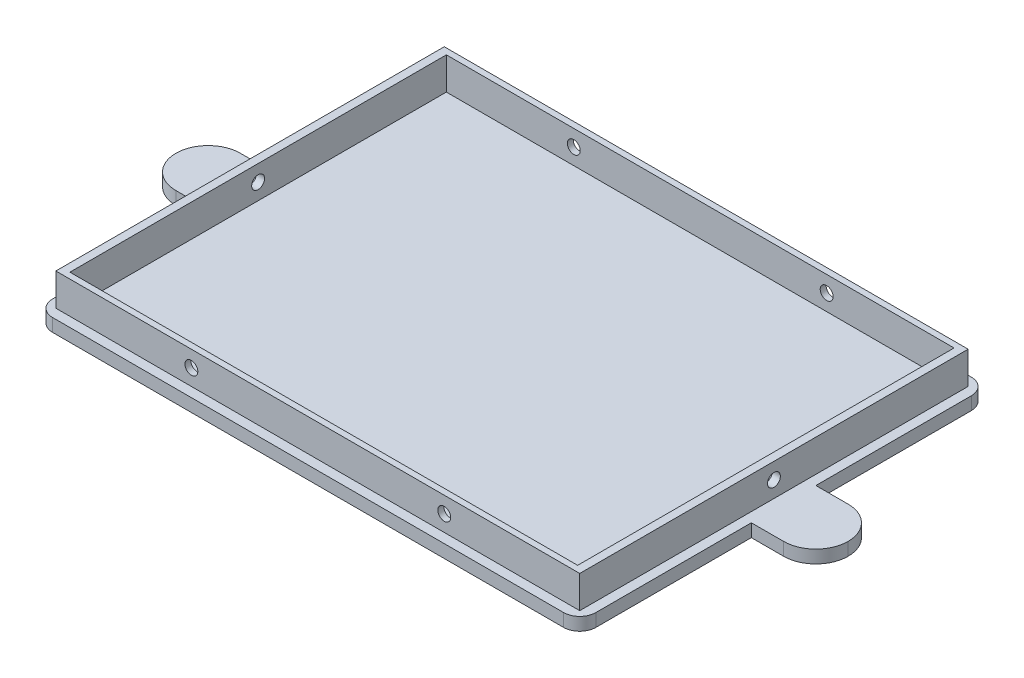
ISO-10303-21;
HEADER;
FILE_DESCRIPTION(('STEP AP214'),'2;1');
FILE_NAME('part.step','',(''),(''),'','','');
FILE_SCHEMA(('AUTOMOTIVE_DESIGN { 1 0 10303 214 1 1 1 1 }'));
ENDSEC;
DATA;
#1=APPLICATION_CONTEXT('core data for automotive mechanical design processes');
#2=APPLICATION_PROTOCOL_DEFINITION('international standard','automotive_design',2000,#1);
#3=PRODUCT_CONTEXT('',#1,'mechanical');
#4=PRODUCT('Part','Part','',(#3));
#5=PRODUCT_RELATED_PRODUCT_CATEGORY('part','',(#4));
#6=PRODUCT_DEFINITION_FORMATION('','',#4);
#7=PRODUCT_DEFINITION_CONTEXT('part definition',#1,'design');
#8=PRODUCT_DEFINITION('design','',#6,#7);
#9=PRODUCT_DEFINITION_SHAPE('','',#8);
#10=(LENGTH_UNIT() NAMED_UNIT(*) SI_UNIT(.MILLI.,.METRE.));
#11=(NAMED_UNIT(*) PLANE_ANGLE_UNIT() SI_UNIT($,.RADIAN.));
#12=(NAMED_UNIT(*) SI_UNIT($,.STERADIAN.) SOLID_ANGLE_UNIT());
#13=UNCERTAINTY_MEASURE_WITH_UNIT(LENGTH_MEASURE(1.E-05),#10,'distance_accuracy_value','');
#14=(GEOMETRIC_REPRESENTATION_CONTEXT(3) GLOBAL_UNCERTAINTY_ASSIGNED_CONTEXT((#13)) GLOBAL_UNIT_ASSIGNED_CONTEXT((#10,
#11,#12)) REPRESENTATION_CONTEXT('',''));
#15=CARTESIAN_POINT('',(0.,0.,0.));
#16=DIRECTION('',(0.,0.,1.));
#17=DIRECTION('',(1.,0.,0.));
#18=AXIS2_PLACEMENT_3D('',#15,#16,#17);
#19=CARTESIAN_POINT('',(0.,4.,0.));
#20=DIRECTION('',(0.,1.,0.));
#21=DIRECTION('',(0.,0.,1.));
#22=AXIS2_PLACEMENT_3D('',#19,#20,#21);
#23=PLANE('',#22);
#24=DIRECTION('',(-1.,0.,0.));
#25=VECTOR('',#24,1.);
#26=CARTESIAN_POINT('',(-84.19,4.,-63.195));
#27=LINE('',#26,#25);
#28=CARTESIAN_POINT('',(79.19,4.,-63.195));
#29=VERTEX_POINT('',#28);
#30=CARTESIAN_POINT('',(-79.19,4.,-63.195));
#31=VERTEX_POINT('',#30);
#32=EDGE_CURVE('E293',#29,#31,#27,.T.);
#33=ORIENTED_EDGE('',*,*,#32,.T.);
#34=CARTESIAN_POINT('',(-79.19,4.,-58.195));
#35=DIRECTION('',(0.,1.,0.));
#36=DIRECTION('',(0.,0.,1.));
#37=AXIS2_PLACEMENT_3D('',#34,#35,#36);
#38=CIRCLE('',#37,5.);
#39=CARTESIAN_POINT('',(-84.19,4.,-58.195));
#40=VERTEX_POINT('',#39);
#41=EDGE_CURVE('E396',#31,#40,#38,.T.);
#42=ORIENTED_EDGE('',*,*,#41,.T.);
#43=DIRECTION('',(0.,0.,1.));
#44=VECTOR('',#43,1.);
#45=CARTESIAN_POINT('',(-84.19,4.,-63.195));
#46=LINE('',#45,#44);
#47=CARTESIAN_POINT('',(-84.19,4.,-10.));
#48=VERTEX_POINT('',#47);
#49=EDGE_CURVE('E296',#40,#48,#46,.T.);
#50=ORIENTED_EDGE('',*,*,#49,.T.);
#51=DIRECTION('',(-1.,0.,0.));
#52=VECTOR('',#51,1.);
#53=CARTESIAN_POINT('',(-84.19,4.,-10.));
#54=LINE('',#53,#52);
#55=CARTESIAN_POINT('',(-94.19,4.,-10.));
#56=VERTEX_POINT('',#55);
#57=EDGE_CURVE('E298',#48,#56,#54,.T.);
#58=ORIENTED_EDGE('',*,*,#57,.T.);
#59=CARTESIAN_POINT('',(-94.19,4.,0.));
#60=DIRECTION('',(0.,1.,0.));
#61=DIRECTION('',(0.,0.,1.));
#62=AXIS2_PLACEMENT_3D('',#59,#60,#61);
#63=CIRCLE('',#62,10.);
#64=CARTESIAN_POINT('',(-104.19,4.,0.));
#65=VERTEX_POINT('',#64);
#66=EDGE_CURVE('E356',#56,#65,#63,.T.);
#67=ORIENTED_EDGE('',*,*,#66,.T.);
#68=CARTESIAN_POINT('',(-94.19,4.,0.));
#69=DIRECTION('',(0.,1.,0.));
#70=DIRECTION('',(0.,0.,1.));
#71=AXIS2_PLACEMENT_3D('',#68,#69,#70);
#72=CIRCLE('',#71,10.);
#73=CARTESIAN_POINT('',(-94.19,4.,10.));
#74=VERTEX_POINT('',#73);
#75=EDGE_CURVE('E354',#65,#74,#72,.T.);
#76=ORIENTED_EDGE('',*,*,#75,.T.);
#77=DIRECTION('',(1.,0.,0.));
#78=VECTOR('',#77,1.);
#79=CARTESIAN_POINT('',(-104.19,4.,10.));
#80=LINE('',#79,#78);
#81=CARTESIAN_POINT('',(-84.19,4.,10.));
#82=VERTEX_POINT('',#81);
#83=EDGE_CURVE('E301',#74,#82,#80,.T.);
#84=ORIENTED_EDGE('',*,*,#83,.T.);
#85=DIRECTION('',(0.,0.,1.));
#86=VECTOR('',#85,1.);
#87=CARTESIAN_POINT('',(-84.19,4.,10.));
#88=LINE('',#87,#86);
#89=CARTESIAN_POINT('',(-84.19,4.,58.195));
#90=VERTEX_POINT('',#89);
#91=EDGE_CURVE('E303',#82,#90,#88,.T.);
#92=ORIENTED_EDGE('',*,*,#91,.T.);
#93=CARTESIAN_POINT('',(-79.19,4.,58.195));
#94=DIRECTION('',(0.,1.,0.));
#95=DIRECTION('',(0.,0.,1.));
#96=AXIS2_PLACEMENT_3D('',#93,#94,#95);
#97=CIRCLE('',#96,5.);
#98=CARTESIAN_POINT('',(-79.19,4.,63.195));
#99=VERTEX_POINT('',#98);
#100=EDGE_CURVE('E391',#90,#99,#97,.T.);
#101=ORIENTED_EDGE('',*,*,#100,.T.);
#102=DIRECTION('',(1.,0.,0.));
#103=VECTOR('',#102,1.);
#104=CARTESIAN_POINT('',(-84.19,4.,63.195));
#105=LINE('',#104,#103);
#106=CARTESIAN_POINT('',(79.19,4.,63.195));
#107=VERTEX_POINT('',#106);
#108=EDGE_CURVE('E306',#99,#107,#105,.T.);
#109=ORIENTED_EDGE('',*,*,#108,.T.);
#110=CARTESIAN_POINT('',(79.19,4.,58.195));
#111=DIRECTION('',(0.,1.,0.));
#112=DIRECTION('',(0.,0.,1.));
#113=AXIS2_PLACEMENT_3D('',#110,#111,#112);
#114=CIRCLE('',#113,5.);
#115=CARTESIAN_POINT('',(84.19,4.,58.195));
#116=VERTEX_POINT('',#115);
#117=EDGE_CURVE('E50',#107,#116,#114,.T.);
#118=ORIENTED_EDGE('',*,*,#117,.T.);
#119=DIRECTION('',(0.,0.,-1.));
#120=VECTOR('',#119,1.);
#121=CARTESIAN_POINT('',(84.1899999999999,4.,10.));
#122=LINE('',#121,#120);
#123=CARTESIAN_POINT('',(84.1899999999999,4.,10.));
#124=VERTEX_POINT('',#123);
#125=EDGE_CURVE('E282',#116,#124,#122,.T.);
#126=ORIENTED_EDGE('',*,*,#125,.T.);
#127=DIRECTION('',(1.,0.,0.));
#128=VECTOR('',#127,1.);
#129=CARTESIAN_POINT('',(104.19,4.,10.));
#130=LINE('',#129,#128);
#131=CARTESIAN_POINT('',(94.19,4.,10.));
#132=VERTEX_POINT('',#131);
#133=EDGE_CURVE('E284',#124,#132,#130,.T.);
#134=ORIENTED_EDGE('',*,*,#133,.T.);
#135=CARTESIAN_POINT('',(94.19,4.,0.));
#136=DIRECTION('',(0.,1.,0.));
#137=DIRECTION('',(0.,0.,1.));
#138=AXIS2_PLACEMENT_3D('',#135,#136,#137);
#139=CIRCLE('',#138,10.);
#140=CARTESIAN_POINT('',(104.19,4.,0.));
#141=VERTEX_POINT('',#140);
#142=EDGE_CURVE('E358',#132,#141,#139,.T.);
#143=ORIENTED_EDGE('',*,*,#142,.T.);
#144=CARTESIAN_POINT('',(94.19,4.,0.));
#145=DIRECTION('',(0.,1.,0.));
#146=DIRECTION('',(0.,0.,1.));
#147=AXIS2_PLACEMENT_3D('',#144,#145,#146);
#148=CIRCLE('',#147,10.);
#149=CARTESIAN_POINT('',(94.19,4.,-10.));
#150=VERTEX_POINT('',#149);
#151=EDGE_CURVE('E360',#141,#150,#148,.T.);
#152=ORIENTED_EDGE('',*,*,#151,.T.);
#153=DIRECTION('',(-1.,0.,0.));
#154=VECTOR('',#153,1.);
#155=CARTESIAN_POINT('',(84.1899999999999,4.,-10.));
#156=LINE('',#155,#154);
#157=CARTESIAN_POINT('',(84.1899999999999,4.,-10.));
#158=VERTEX_POINT('',#157);
#159=EDGE_CURVE('E288',#150,#158,#156,.T.);
#160=ORIENTED_EDGE('',*,*,#159,.T.);
#161=DIRECTION('',(0.,0.,-1.));
#162=VECTOR('',#161,1.);
#163=CARTESIAN_POINT('',(84.19,4.,-63.195));
#164=LINE('',#163,#162);
#165=CARTESIAN_POINT('',(84.19,4.,-58.195));
#166=VERTEX_POINT('',#165);
#167=EDGE_CURVE('E290',#158,#166,#164,.T.);
#168=ORIENTED_EDGE('',*,*,#167,.T.);
#169=CARTESIAN_POINT('',(79.19,4.,-58.195));
#170=DIRECTION('',(0.,1.,0.));
#171=DIRECTION('',(0.,0.,1.));
#172=AXIS2_PLACEMENT_3D('',#169,#170,#171);
#173=CIRCLE('',#172,5.);
#174=EDGE_CURVE('E394',#166,#29,#173,.T.);
#175=ORIENTED_EDGE('',*,*,#174,.T.);
#176=EDGE_LOOP('',(#33,#42,#50,#58,#67,#76,#84,#92,#101,#109,#118,#126,#134,#143,#152,#160,#168,#175));
#177=FACE_BOUND('',#176,.T.);
#178=DIRECTION('',(-1.,0.,0.));
#179=VECTOR('',#178,1.);
#180=CARTESIAN_POINT('',(-81.19,4.,-60.195));
#181=LINE('',#180,#179);
#182=CARTESIAN_POINT('',(81.19,4.,-60.195));
#183=VERTEX_POINT('',#182);
#184=CARTESIAN_POINT('',(-81.19,4.,-60.195));
#185=VERTEX_POINT('',#184);
#186=EDGE_CURVE('E266',#183,#185,#181,.T.);
#187=ORIENTED_EDGE('',*,*,#186,.F.);
#188=DIRECTION('',(0.,0.,-1.));
#189=VECTOR('',#188,1.);
#190=CARTESIAN_POINT('',(81.19,4.,-60.195));
#191=LINE('',#190,#189);
#192=CARTESIAN_POINT('',(81.19,4.,60.195));
#193=VERTEX_POINT('',#192);
#194=EDGE_CURVE('E228',#193,#183,#191,.T.);
#195=ORIENTED_EDGE('',*,*,#194,.F.);
#196=DIRECTION('',(1.,0.,0.));
#197=VECTOR('',#196,1.);
#198=CARTESIAN_POINT('',(-81.19,4.,60.195));
#199=LINE('',#198,#197);
#200=CARTESIAN_POINT('',(-81.19,4.,60.195));
#201=VERTEX_POINT('',#200);
#202=EDGE_CURVE('E257',#201,#193,#199,.T.);
#203=ORIENTED_EDGE('',*,*,#202,.F.);
#204=DIRECTION('',(0.,0.,1.));
#205=VECTOR('',#204,1.);
#206=CARTESIAN_POINT('',(-81.19,4.,-60.195));
#207=LINE('',#206,#205);
#208=EDGE_CURVE('E268',#185,#201,#207,.T.);
#209=ORIENTED_EDGE('',*,*,#208,.F.);
#210=EDGE_LOOP('',(#187,#195,#203,#209));
#211=FACE_BOUND('',#210,.T.);
#212=ADVANCED_FACE('F33',(#177,#211),#23,.T.);
#213=CARTESIAN_POINT('',(84.1899999999999,4.,10.));
#214=DIRECTION('',(-1.,0.,0.));
#215=DIRECTION('',(0.,0.,1.));
#216=AXIS2_PLACEMENT_3D('',#213,#214,#215);
#217=PLANE('',#216);
#218=ORIENTED_EDGE('',*,*,#125,.F.);
#219=DIRECTION('',(0.,-1.,0.));
#220=VECTOR('',#219,1.);
#221=CARTESIAN_POINT('',(84.19,4.,58.195));
#222=LINE('',#221,#220);
#223=CARTESIAN_POINT('',(84.19,0.,58.195));
#224=VERTEX_POINT('',#223);
#225=EDGE_CURVE('E400',#116,#224,#222,.T.);
#226=ORIENTED_EDGE('',*,*,#225,.T.);
#227=DIRECTION('',(0.,0.,-1.));
#228=VECTOR('',#227,1.);
#229=CARTESIAN_POINT('',(84.1899999999999,0.,10.));
#230=LINE('',#229,#228);
#231=CARTESIAN_POINT('',(84.1899999999999,0.,10.));
#232=VERTEX_POINT('',#231);
#233=EDGE_CURVE('E281',#224,#232,#230,.T.);
#234=ORIENTED_EDGE('',*,*,#233,.T.);
#235=DIRECTION('',(0.,-1.,0.));
#236=VECTOR('',#235,1.);
#237=CARTESIAN_POINT('',(84.1899999999999,4.,10.));
#238=LINE('',#237,#236);
#239=EDGE_CURVE('E340',#124,#232,#238,.T.);
#240=ORIENTED_EDGE('',*,*,#239,.F.);
#241=EDGE_LOOP('',(#218,#226,#234,#240));
#242=FACE_BOUND('',#241,.T.);
#243=ADVANCED_FACE('F461',(#242),#217,.F.);
#244=CARTESIAN_POINT('',(104.19,4.,10.));
#245=DIRECTION('',(0.,0.,-1.));
#246=DIRECTION('',(-1.,0.,0.));
#247=AXIS2_PLACEMENT_3D('',#244,#245,#246);
#248=PLANE('',#247);
#249=DIRECTION('',(1.,0.,0.));
#250=VECTOR('',#249,1.);
#251=CARTESIAN_POINT('',(104.19,0.,10.));
#252=LINE('',#251,#250);
#253=CARTESIAN_POINT('',(94.19,0.,10.));
#254=VERTEX_POINT('',#253);
#255=EDGE_CURVE('E310',#232,#254,#252,.T.);
#256=ORIENTED_EDGE('',*,*,#255,.T.);
#257=DIRECTION('',(0.,-1.,0.));
#258=VECTOR('',#257,1.);
#259=CARTESIAN_POINT('',(94.19,4.,10.));
#260=LINE('',#259,#258);
#261=EDGE_CURVE('E362',#254,#132,#260,.F.);
#262=ORIENTED_EDGE('',*,*,#261,.T.);
#263=ORIENTED_EDGE('',*,*,#133,.F.);
#264=ORIENTED_EDGE('',*,*,#239,.T.);
#265=EDGE_LOOP('',(#256,#262,#263,#264));
#266=FACE_BOUND('',#265,.T.);
#267=ADVANCED_FACE('F467',(#266),#248,.F.);
#268=CARTESIAN_POINT('',(84.1899999999999,4.,-10.));
#269=DIRECTION('',(0.,0.,1.));
#270=DIRECTION('',(1.,0.,0.));
#271=AXIS2_PLACEMENT_3D('',#268,#269,#270);
#272=PLANE('',#271);
#273=ORIENTED_EDGE('',*,*,#159,.F.);
#274=DIRECTION('',(0.,-1.,0.));
#275=VECTOR('',#274,1.);
#276=CARTESIAN_POINT('',(94.19,4.,-10.));
#277=LINE('',#276,#275);
#278=CARTESIAN_POINT('',(94.19,0.,-10.));
#279=VERTEX_POINT('',#278);
#280=EDGE_CURVE('E343',#150,#279,#277,.T.);
#281=ORIENTED_EDGE('',*,*,#280,.T.);
#282=DIRECTION('',(-1.,0.,0.));
#283=VECTOR('',#282,1.);
#284=CARTESIAN_POINT('',(84.1899999999999,0.,-10.));
#285=LINE('',#284,#283);
#286=CARTESIAN_POINT('',(84.1899999999999,0.,-10.));
#287=VERTEX_POINT('',#286);
#288=EDGE_CURVE('E313',#279,#287,#285,.T.);
#289=ORIENTED_EDGE('',*,*,#288,.T.);
#290=DIRECTION('',(0.,-1.,0.));
#291=VECTOR('',#290,1.);
#292=CARTESIAN_POINT('',(84.1899999999999,4.,-10.));
#293=LINE('',#292,#291);
#294=EDGE_CURVE('E337',#158,#287,#293,.T.);
#295=ORIENTED_EDGE('',*,*,#294,.F.);
#296=EDGE_LOOP('',(#273,#281,#289,#295));
#297=FACE_BOUND('',#296,.T.);
#298=ADVANCED_FACE('F723',(#297),#272,.F.);
#299=CARTESIAN_POINT('',(84.19,4.,-63.195));
#300=DIRECTION('',(-1.,0.,0.));
#301=DIRECTION('',(0.,0.,1.));
#302=AXIS2_PLACEMENT_3D('',#299,#300,#301);
#303=PLANE('',#302);
#304=DIRECTION('',(0.,0.,-1.));
#305=VECTOR('',#304,1.);
#306=CARTESIAN_POINT('',(84.19,0.,-63.195));
#307=LINE('',#306,#305);
#308=CARTESIAN_POINT('',(84.19,0.,-58.195));
#309=VERTEX_POINT('',#308);
#310=EDGE_CURVE('E315',#287,#309,#307,.T.);
#311=ORIENTED_EDGE('',*,*,#310,.T.);
#312=DIRECTION('',(0.,-1.,0.));
#313=VECTOR('',#312,1.);
#314=CARTESIAN_POINT('',(84.19,4.,-58.195));
#315=LINE('',#314,#313);
#316=EDGE_CURVE('E398',#309,#166,#315,.F.);
#317=ORIENTED_EDGE('',*,*,#316,.T.);
#318=ORIENTED_EDGE('',*,*,#167,.F.);
#319=ORIENTED_EDGE('',*,*,#294,.T.);
#320=EDGE_LOOP('',(#311,#317,#318,#319));
#321=FACE_BOUND('',#320,.T.);
#322=ADVANCED_FACE('F728',(#321),#303,.F.);
#323=CARTESIAN_POINT('',(-84.19,4.,-63.195));
#324=DIRECTION('',(0.,0.,1.));
#325=DIRECTION('',(1.,0.,0.));
#326=AXIS2_PLACEMENT_3D('',#323,#324,#325);
#327=PLANE('',#326);
#328=DIRECTION('',(-1.,0.,0.));
#329=VECTOR('',#328,1.);
#330=CARTESIAN_POINT('',(-84.19,0.,-63.195));
#331=LINE('',#330,#329);
#332=CARTESIAN_POINT('',(79.19,0.,-63.195));
#333=VERTEX_POINT('',#332);
#334=CARTESIAN_POINT('',(-79.19,0.,-63.195));
#335=VERTEX_POINT('',#334);
#336=EDGE_CURVE('E318',#333,#335,#331,.T.);
#337=ORIENTED_EDGE('',*,*,#336,.T.);
#338=DIRECTION('',(0.,-1.,0.));
#339=VECTOR('',#338,1.);
#340=CARTESIAN_POINT('',(-79.19,4.,-63.195));
#341=LINE('',#340,#339);
#342=EDGE_CURVE('E389',#335,#31,#341,.F.);
#343=ORIENTED_EDGE('',*,*,#342,.T.);
#344=ORIENTED_EDGE('',*,*,#32,.F.);
#345=DIRECTION('',(0.,-1.,0.));
#346=VECTOR('',#345,1.);
#347=CARTESIAN_POINT('',(79.19,4.,-63.195));
#348=LINE('',#347,#346);
#349=EDGE_CURVE('E386',#29,#333,#348,.T.);
#350=ORIENTED_EDGE('',*,*,#349,.T.);
#351=EDGE_LOOP('',(#337,#343,#344,#350));
#352=FACE_BOUND('',#351,.T.);
#353=ADVANCED_FACE('F793',(#352),#327,.F.);
#354=CARTESIAN_POINT('',(-84.19,4.,-63.195));
#355=DIRECTION('',(1.,0.,0.));
#356=DIRECTION('',(0.,0.,-1.));
#357=AXIS2_PLACEMENT_3D('',#354,#355,#356);
#358=PLANE('',#357);
#359=ORIENTED_EDGE('',*,*,#49,.F.);
#360=DIRECTION('',(0.,-1.,0.));
#361=VECTOR('',#360,1.);
#362=CARTESIAN_POINT('',(-84.19,4.,-58.195));
#363=LINE('',#362,#361);
#364=CARTESIAN_POINT('',(-84.19,0.,-58.195));
#365=VERTEX_POINT('',#364);
#366=EDGE_CURVE('E369',#40,#365,#363,.T.);
#367=ORIENTED_EDGE('',*,*,#366,.T.);
#368=DIRECTION('',(0.,0.,1.));
#369=VECTOR('',#368,1.);
#370=CARTESIAN_POINT('',(-84.19,0.,-63.195));
#371=LINE('',#370,#369);
#372=CARTESIAN_POINT('',(-84.19,0.,-10.));
#373=VERTEX_POINT('',#372);
#374=EDGE_CURVE('E321',#365,#373,#371,.T.);
#375=ORIENTED_EDGE('',*,*,#374,.T.);
#376=DIRECTION('',(0.,-1.,0.));
#377=VECTOR('',#376,1.);
#378=CARTESIAN_POINT('',(-84.19,4.,-10.));
#379=LINE('',#378,#377);
#380=EDGE_CURVE('E334',#48,#373,#379,.T.);
#381=ORIENTED_EDGE('',*,*,#380,.F.);
#382=EDGE_LOOP('',(#359,#367,#375,#381));
#383=FACE_BOUND('',#382,.T.);
#384=ADVANCED_FACE('F715',(#383),#358,.F.);
#385=CARTESIAN_POINT('',(-84.19,4.,-10.));
#386=DIRECTION('',(0.,0.,1.));
#387=DIRECTION('',(1.,0.,0.));
#388=AXIS2_PLACEMENT_3D('',#385,#386,#387);
#389=PLANE('',#388);
#390=DIRECTION('',(-1.,0.,0.));
#391=VECTOR('',#390,1.);
#392=CARTESIAN_POINT('',(-84.19,0.,-10.));
#393=LINE('',#392,#391);
#394=CARTESIAN_POINT('',(-94.19,0.,-10.));
#395=VERTEX_POINT('',#394);
#396=EDGE_CURVE('E323',#373,#395,#393,.T.);
#397=ORIENTED_EDGE('',*,*,#396,.T.);
#398=DIRECTION('',(0.,-1.,0.));
#399=VECTOR('',#398,1.);
#400=CARTESIAN_POINT('',(-94.19,4.,-10.));
#401=LINE('',#400,#399);
#402=EDGE_CURVE('E364',#395,#56,#401,.F.);
#403=ORIENTED_EDGE('',*,*,#402,.T.);
#404=ORIENTED_EDGE('',*,*,#57,.F.);
#405=ORIENTED_EDGE('',*,*,#380,.T.);
#406=EDGE_LOOP('',(#397,#403,#404,#405));
#407=FACE_BOUND('',#406,.T.);
#408=ADVANCED_FACE('F703',(#407),#389,.F.);
#409=CARTESIAN_POINT('',(-104.19,4.,10.));
#410=DIRECTION('',(0.,0.,-1.));
#411=DIRECTION('',(-1.,0.,0.));
#412=AXIS2_PLACEMENT_3D('',#409,#410,#411);
#413=PLANE('',#412);
#414=ORIENTED_EDGE('',*,*,#83,.F.);
#415=DIRECTION('',(0.,-1.,0.));
#416=VECTOR('',#415,1.);
#417=CARTESIAN_POINT('',(-94.19,4.,10.));
#418=LINE('',#417,#416);
#419=CARTESIAN_POINT('',(-94.19,0.,10.));
#420=VERTEX_POINT('',#419);
#421=EDGE_CURVE('E367',#74,#420,#418,.T.);
#422=ORIENTED_EDGE('',*,*,#421,.T.);
#423=DIRECTION('',(1.,0.,0.));
#424=VECTOR('',#423,1.);
#425=CARTESIAN_POINT('',(-104.19,0.,10.));
#426=LINE('',#425,#424);
#427=CARTESIAN_POINT('',(-84.19,0.,10.));
#428=VERTEX_POINT('',#427);
#429=EDGE_CURVE('E326',#420,#428,#426,.T.);
#430=ORIENTED_EDGE('',*,*,#429,.T.);
#431=DIRECTION('',(0.,-1.,0.));
#432=VECTOR('',#431,1.);
#433=CARTESIAN_POINT('',(-84.19,4.,10.));
#434=LINE('',#433,#432);
#435=EDGE_CURVE('E308',#82,#428,#434,.T.);
#436=ORIENTED_EDGE('',*,*,#435,.F.);
#437=EDGE_LOOP('',(#414,#422,#430,#436));
#438=FACE_BOUND('',#437,.T.);
#439=ADVANCED_FACE('F697',(#438),#413,.F.);
#440=CARTESIAN_POINT('',(-84.19,4.,10.));
#441=DIRECTION('',(1.,0.,0.));
#442=DIRECTION('',(0.,0.,-1.));
#443=AXIS2_PLACEMENT_3D('',#440,#441,#442);
#444=PLANE('',#443);
#445=DIRECTION('',(0.,0.,1.));
#446=VECTOR('',#445,1.);
#447=CARTESIAN_POINT('',(-84.19,0.,10.));
#448=LINE('',#447,#446);
#449=CARTESIAN_POINT('',(-84.19,0.,58.195));
#450=VERTEX_POINT('',#449);
#451=EDGE_CURVE('E328',#428,#450,#448,.T.);
#452=ORIENTED_EDGE('',*,*,#451,.T.);
#453=DIRECTION('',(0.,-1.,0.));
#454=VECTOR('',#453,1.);
#455=CARTESIAN_POINT('',(-84.19,4.,58.195));
#456=LINE('',#455,#454);
#457=EDGE_CURVE('E11',#450,#90,#456,.F.);
#458=ORIENTED_EDGE('',*,*,#457,.T.);
#459=ORIENTED_EDGE('',*,*,#91,.F.);
#460=ORIENTED_EDGE('',*,*,#435,.T.);
#461=EDGE_LOOP('',(#452,#458,#459,#460));
#462=FACE_BOUND('',#461,.T.);
#463=ADVANCED_FACE('F702',(#462),#444,.F.);
#464=CARTESIAN_POINT('',(-84.19,4.,63.195));
#465=DIRECTION('',(0.,0.,-1.));
#466=DIRECTION('',(-1.,0.,0.));
#467=AXIS2_PLACEMENT_3D('',#464,#465,#466);
#468=PLANE('',#467);
#469=DIRECTION('',(1.,0.,0.));
#470=VECTOR('',#469,1.);
#471=CARTESIAN_POINT('',(-84.19,0.,63.195));
#472=LINE('',#471,#470);
#473=CARTESIAN_POINT('',(-79.19,0.,63.195));
#474=VERTEX_POINT('',#473);
#475=CARTESIAN_POINT('',(79.19,0.,63.195));
#476=VERTEX_POINT('',#475);
#477=EDGE_CURVE('E285',#474,#476,#472,.T.);
#478=ORIENTED_EDGE('',*,*,#477,.T.);
#479=DIRECTION('',(0.,-1.,0.));
#480=VECTOR('',#479,1.);
#481=CARTESIAN_POINT('',(79.19,4.,63.195));
#482=LINE('',#481,#480);
#483=EDGE_CURVE('E42',#476,#107,#482,.F.);
#484=ORIENTED_EDGE('',*,*,#483,.T.);
#485=ORIENTED_EDGE('',*,*,#108,.F.);
#486=DIRECTION('',(0.,-1.,0.));
#487=VECTOR('',#486,1.);
#488=CARTESIAN_POINT('',(-79.19,4.,63.195));
#489=LINE('',#488,#487);
#490=EDGE_CURVE('E403',#99,#474,#489,.T.);
#491=ORIENTED_EDGE('',*,*,#490,.T.);
#492=EDGE_LOOP('',(#478,#484,#485,#491));
#493=FACE_BOUND('',#492,.T.);
#494=ADVANCED_FACE('F772',(#493),#468,.F.);
#495=CARTESIAN_POINT('',(0.,0.,0.));
#496=DIRECTION('',(0.,1.,0.));
#497=DIRECTION('',(0.,0.,1.));
#498=AXIS2_PLACEMENT_3D('',#495,#496,#497);
#499=PLANE('',#498);
#500=ORIENTED_EDGE('',*,*,#374,.F.);
#501=CARTESIAN_POINT('',(-79.19,0.,-58.195));
#502=DIRECTION('',(0.,1.,0.));
#503=DIRECTION('',(0.,0.,1.));
#504=AXIS2_PLACEMENT_3D('',#501,#502,#503);
#505=CIRCLE('',#504,5.);
#506=EDGE_CURVE('E384',#365,#335,#505,.F.);
#507=ORIENTED_EDGE('',*,*,#506,.T.);
#508=ORIENTED_EDGE('',*,*,#336,.F.);
#509=CARTESIAN_POINT('',(79.19,0.,-58.195));
#510=DIRECTION('',(0.,1.,0.));
#511=DIRECTION('',(0.,0.,1.));
#512=AXIS2_PLACEMENT_3D('',#509,#510,#511);
#513=CIRCLE('',#512,5.);
#514=EDGE_CURVE('E382',#333,#309,#513,.F.);
#515=ORIENTED_EDGE('',*,*,#514,.T.);
#516=ORIENTED_EDGE('',*,*,#310,.F.);
#517=ORIENTED_EDGE('',*,*,#288,.F.);
#518=CARTESIAN_POINT('',(94.19,0.,0.));
#519=DIRECTION('',(0.,1.,0.));
#520=DIRECTION('',(0.,0.,1.));
#521=AXIS2_PLACEMENT_3D('',#518,#519,#520);
#522=CIRCLE('',#521,10.);
#523=CARTESIAN_POINT('',(104.19,0.,0.));
#524=VERTEX_POINT('',#523);
#525=EDGE_CURVE('E352',#279,#524,#522,.F.);
#526=ORIENTED_EDGE('',*,*,#525,.T.);
#527=CARTESIAN_POINT('',(94.19,0.,0.));
#528=DIRECTION('',(0.,1.,0.));
#529=DIRECTION('',(0.,0.,1.));
#530=AXIS2_PLACEMENT_3D('',#527,#528,#529);
#531=CIRCLE('',#530,10.);
#532=EDGE_CURVE('E350',#524,#254,#531,.F.);
#533=ORIENTED_EDGE('',*,*,#532,.T.);
#534=ORIENTED_EDGE('',*,*,#255,.F.);
#535=ORIENTED_EDGE('',*,*,#233,.F.);
#536=CARTESIAN_POINT('',(79.19,0.,58.195));
#537=DIRECTION('',(0.,1.,0.));
#538=DIRECTION('',(0.,0.,1.));
#539=AXIS2_PLACEMENT_3D('',#536,#537,#538);
#540=CIRCLE('',#539,5.);
#541=EDGE_CURVE('E380',#224,#476,#540,.F.);
#542=ORIENTED_EDGE('',*,*,#541,.T.);
#543=ORIENTED_EDGE('',*,*,#477,.F.);
#544=CARTESIAN_POINT('',(-79.19,0.,58.195));
#545=DIRECTION('',(0.,1.,0.));
#546=DIRECTION('',(0.,0.,1.));
#547=AXIS2_PLACEMENT_3D('',#544,#545,#546);
#548=CIRCLE('',#547,5.);
#549=EDGE_CURVE('E378',#474,#450,#548,.F.);
#550=ORIENTED_EDGE('',*,*,#549,.T.);
#551=ORIENTED_EDGE('',*,*,#451,.F.);
#552=ORIENTED_EDGE('',*,*,#429,.F.);
#553=CARTESIAN_POINT('',(-94.19,0.,0.));
#554=DIRECTION('',(0.,1.,0.));
#555=DIRECTION('',(0.,0.,1.));
#556=AXIS2_PLACEMENT_3D('',#553,#554,#555);
#557=CIRCLE('',#556,10.);
#558=CARTESIAN_POINT('',(-104.19,0.,0.));
#559=VERTEX_POINT('',#558);
#560=EDGE_CURVE('E346',#420,#559,#557,.F.);
#561=ORIENTED_EDGE('',*,*,#560,.T.);
#562=CARTESIAN_POINT('',(-94.19,0.,0.));
#563=DIRECTION('',(0.,1.,0.));
#564=DIRECTION('',(0.,0.,1.));
#565=AXIS2_PLACEMENT_3D('',#562,#563,#564);
#566=CIRCLE('',#565,10.);
#567=EDGE_CURVE('E348',#559,#395,#566,.F.);
#568=ORIENTED_EDGE('',*,*,#567,.T.);
#569=ORIENTED_EDGE('',*,*,#396,.F.);
#570=EDGE_LOOP('',(#500,#507,#508,#515,#516,#517,#526,#533,#534,#535,#542,#543,#550,#551,#552,
#561,#568,#569));
#571=FACE_BOUND('',#570,.T.);
#572=ADVANCED_FACE('F507',(#571),#499,.F.);
#573=CARTESIAN_POINT('',(0.,14.,0.));
#574=DIRECTION('',(0.,1.,0.));
#575=DIRECTION('',(0.,0.,1.));
#576=AXIS2_PLACEMENT_3D('',#573,#574,#575);
#577=PLANE('',#576);
#578=DIRECTION('',(0.,0.,-1.));
#579=VECTOR('',#578,1.);
#580=CARTESIAN_POINT('',(81.19,14.,-60.195));
#581=LINE('',#580,#579);
#582=CARTESIAN_POINT('',(81.19,14.,60.195));
#583=VERTEX_POINT('',#582);
#584=CARTESIAN_POINT('',(81.19,14.,-60.195));
#585=VERTEX_POINT('',#584);
#586=EDGE_CURVE('E253',#583,#585,#581,.T.);
#587=ORIENTED_EDGE('',*,*,#586,.T.);
#588=DIRECTION('',(-1.,0.,0.));
#589=VECTOR('',#588,1.);
#590=CARTESIAN_POINT('',(-81.19,14.,-60.195));
#591=LINE('',#590,#589);
#592=CARTESIAN_POINT('',(-81.19,14.,-60.195));
#593=VERTEX_POINT('',#592);
#594=EDGE_CURVE('E256',#585,#593,#591,.T.);
#595=ORIENTED_EDGE('',*,*,#594,.T.);
#596=DIRECTION('',(0.,0.,1.));
#597=VECTOR('',#596,1.);
#598=CARTESIAN_POINT('',(-81.19,14.,-60.195));
#599=LINE('',#598,#597);
#600=CARTESIAN_POINT('',(-81.19,14.,60.195));
#601=VERTEX_POINT('',#600);
#602=EDGE_CURVE('E259',#593,#601,#599,.T.);
#603=ORIENTED_EDGE('',*,*,#602,.T.);
#604=DIRECTION('',(1.,0.,0.));
#605=VECTOR('',#604,1.);
#606=CARTESIAN_POINT('',(-81.19,14.,60.195));
#607=LINE('',#606,#605);
#608=EDGE_CURVE('E261',#601,#583,#607,.T.);
#609=ORIENTED_EDGE('',*,*,#608,.T.);
#610=EDGE_LOOP('',(#587,#595,#603,#609));
#611=FACE_BOUND('',#610,.T.);
#612=DIRECTION('',(-1.,0.,0.));
#613=VECTOR('',#612,1.);
#614=CARTESIAN_POINT('',(-78.69,14.,-58.3414773986944));
#615=LINE('',#614,#613);
#616=CARTESIAN_POINT('',(78.69,14.,-58.3414773986944));
#617=VERTEX_POINT('',#616);
#618=CARTESIAN_POINT('',(-78.69,14.,-58.3414773986944));
#619=VERTEX_POINT('',#618);
#620=EDGE_CURVE('E219',#617,#619,#615,.T.);
#621=ORIENTED_EDGE('',*,*,#620,.F.);
#622=DIRECTION('',(0.,0.,-1.));
#623=VECTOR('',#622,1.);
#624=CARTESIAN_POINT('',(78.69,14.,-58.3414773986944));
#625=LINE('',#624,#623);
#626=CARTESIAN_POINT('',(78.69,14.,58.3414773986944));
#627=VERTEX_POINT('',#626);
#628=EDGE_CURVE('E209',#627,#617,#625,.T.);
#629=ORIENTED_EDGE('',*,*,#628,.F.);
#630=DIRECTION('',(1.,0.,0.));
#631=VECTOR('',#630,1.);
#632=CARTESIAN_POINT('',(-78.69,14.,58.3414773986944));
#633=LINE('',#632,#631);
#634=CARTESIAN_POINT('',(-78.69,14.,58.3414773986944));
#635=VERTEX_POINT('',#634);
#636=EDGE_CURVE('E236',#635,#627,#633,.T.);
#637=ORIENTED_EDGE('',*,*,#636,.F.);
#638=DIRECTION('',(0.,0.,1.));
#639=VECTOR('',#638,1.);
#640=CARTESIAN_POINT('',(-78.69,14.,-58.3414773986944));
#641=LINE('',#640,#639);
#642=EDGE_CURVE('E234',#619,#635,#641,.T.);
#643=ORIENTED_EDGE('',*,*,#642,.F.);
#644=EDGE_LOOP('',(#621,#629,#637,#643));
#645=FACE_BOUND('',#644,.T.);
#646=ADVANCED_FACE('F232',(#611,#645),#577,.T.);
#647=CARTESIAN_POINT('',(81.19,14.,-60.195));
#648=DIRECTION('',(-1.,0.,0.));
#649=DIRECTION('',(0.,0.,1.));
#650=AXIS2_PLACEMENT_3D('',#647,#648,#649);
#651=PLANE('',#650);
#652=CARTESIAN_POINT('',(81.19,9.,0.));
#653=DIRECTION('',(1.,0.,0.));
#654=DIRECTION('',(0.,0.,-1.));
#655=AXIS2_PLACEMENT_3D('',#652,#653,#654);
#656=CIRCLE('',#655,2.);
#657=CARTESIAN_POINT('',(81.19,9.,-2.));
#658=VERTEX_POINT('',#657);
#659=EDGE_CURVE('E410',#658,#658,#656,.T.);
#660=ORIENTED_EDGE('',*,*,#659,.F.);
#661=EDGE_LOOP('',(#660));
#662=FACE_BOUND('',#661,.T.);
#663=ORIENTED_EDGE('',*,*,#194,.T.);
#664=DIRECTION('',(0.,-1.,0.));
#665=VECTOR('',#664,1.);
#666=CARTESIAN_POINT('',(81.19,14.,-60.195));
#667=LINE('',#666,#665);
#668=EDGE_CURVE('E279',#585,#183,#667,.T.);
#669=ORIENTED_EDGE('',*,*,#668,.F.);
#670=ORIENTED_EDGE('',*,*,#586,.F.);
#671=DIRECTION('',(0.,-1.,0.));
#672=VECTOR('',#671,1.);
#673=CARTESIAN_POINT('',(81.19,14.,60.195));
#674=LINE('',#673,#672);
#675=EDGE_CURVE('E263',#583,#193,#674,.T.);
#676=ORIENTED_EDGE('',*,*,#675,.T.);
#677=EDGE_LOOP('',(#663,#669,#670,#676));
#678=FACE_BOUND('',#677,.T.);
#679=ADVANCED_FACE('F506',(#662,#678),#651,.F.);
#680=CARTESIAN_POINT('',(-81.19,14.,-60.195));
#681=DIRECTION('',(0.,0.,1.));
#682=DIRECTION('',(1.,0.,0.));
#683=AXIS2_PLACEMENT_3D('',#680,#681,#682);
#684=PLANE('',#683);
#685=CARTESIAN_POINT('',(-39.19,9.,-60.195));
#686=DIRECTION('',(0.,0.,1.));
#687=DIRECTION('',(1.,0.,0.));
#688=AXIS2_PLACEMENT_3D('',#685,#686,#687);
#689=CIRCLE('',#688,2.);
#690=CARTESIAN_POINT('',(-37.19,9.,-60.195));
#691=VERTEX_POINT('',#690);
#692=EDGE_CURVE('E433',#691,#691,#689,.T.);
#693=ORIENTED_EDGE('',*,*,#692,.T.);
#694=EDGE_LOOP('',(#693));
#695=FACE_BOUND('',#694,.T.);
#696=CARTESIAN_POINT('',(39.19,9.,-60.195));
#697=DIRECTION('',(0.,0.,1.));
#698=DIRECTION('',(1.,0.,0.));
#699=AXIS2_PLACEMENT_3D('',#696,#697,#698);
#700=CIRCLE('',#699,2.);
#701=CARTESIAN_POINT('',(41.19,9.,-60.195));
#702=VERTEX_POINT('',#701);
#703=EDGE_CURVE('E422',#702,#702,#700,.T.);
#704=ORIENTED_EDGE('',*,*,#703,.T.);
#705=EDGE_LOOP('',(#704));
#706=FACE_BOUND('',#705,.T.);
#707=ORIENTED_EDGE('',*,*,#186,.T.);
#708=DIRECTION('',(0.,-1.,0.));
#709=VECTOR('',#708,1.);
#710=CARTESIAN_POINT('',(-81.19,14.,-60.195));
#711=LINE('',#710,#709);
#712=EDGE_CURVE('E276',#593,#185,#711,.T.);
#713=ORIENTED_EDGE('',*,*,#712,.F.);
#714=ORIENTED_EDGE('',*,*,#594,.F.);
#715=ORIENTED_EDGE('',*,*,#668,.T.);
#716=EDGE_LOOP('',(#707,#713,#714,#715));
#717=FACE_BOUND('',#716,.T.);
#718=ADVANCED_FACE('F514',(#695,#706,#717),#684,.F.);
#719=CARTESIAN_POINT('',(-81.19,14.,-60.195));
#720=DIRECTION('',(1.,0.,0.));
#721=DIRECTION('',(0.,0.,-1.));
#722=AXIS2_PLACEMENT_3D('',#719,#720,#721);
#723=PLANE('',#722);
#724=CARTESIAN_POINT('',(-81.19,9.,0.));
#725=DIRECTION('',(1.,0.,0.));
#726=DIRECTION('',(0.,0.,-1.));
#727=AXIS2_PLACEMENT_3D('',#724,#725,#726);
#728=CIRCLE('',#727,2.);
#729=CARTESIAN_POINT('',(-81.19,9.,-2.));
#730=VERTEX_POINT('',#729);
#731=EDGE_CURVE('E375',#730,#730,#728,.T.);
#732=ORIENTED_EDGE('',*,*,#731,.T.);
#733=EDGE_LOOP('',(#732));
#734=FACE_BOUND('',#733,.T.);
#735=ORIENTED_EDGE('',*,*,#208,.T.);
#736=DIRECTION('',(0.,-1.,0.));
#737=VECTOR('',#736,1.);
#738=CARTESIAN_POINT('',(-81.19,14.,60.195));
#739=LINE('',#738,#737);
#740=EDGE_CURVE('E274',#601,#201,#739,.T.);
#741=ORIENTED_EDGE('',*,*,#740,.F.);
#742=ORIENTED_EDGE('',*,*,#602,.F.);
#743=ORIENTED_EDGE('',*,*,#712,.T.);
#744=EDGE_LOOP('',(#735,#741,#742,#743));
#745=FACE_BOUND('',#744,.T.);
#746=ADVANCED_FACE('F442',(#734,#745),#723,.F.);
#747=CARTESIAN_POINT('',(-81.19,14.,60.195));
#748=DIRECTION('',(0.,0.,-1.));
#749=DIRECTION('',(-1.,0.,0.));
#750=AXIS2_PLACEMENT_3D('',#747,#748,#749);
#751=PLANE('',#750);
#752=CARTESIAN_POINT('',(-39.19,9.,60.195));
#753=DIRECTION('',(0.,0.,-1.));
#754=DIRECTION('',(-1.,0.,0.));
#755=AXIS2_PLACEMENT_3D('',#752,#753,#754);
#756=CIRCLE('',#755,2.);
#757=CARTESIAN_POINT('',(-41.19,9.,60.195));
#758=VERTEX_POINT('',#757);
#759=EDGE_CURVE('E430',#758,#758,#756,.T.);
#760=ORIENTED_EDGE('',*,*,#759,.T.);
#761=EDGE_LOOP('',(#760));
#762=FACE_BOUND('',#761,.T.);
#763=CARTESIAN_POINT('',(39.19,9.,60.195));
#764=DIRECTION('',(0.,0.,-1.));
#765=DIRECTION('',(-1.,0.,0.));
#766=AXIS2_PLACEMENT_3D('',#763,#764,#765);
#767=CIRCLE('',#766,2.);
#768=CARTESIAN_POINT('',(37.19,9.,60.195));
#769=VERTEX_POINT('',#768);
#770=EDGE_CURVE('E417',#769,#769,#767,.T.);
#771=ORIENTED_EDGE('',*,*,#770,.T.);
#772=EDGE_LOOP('',(#771));
#773=FACE_BOUND('',#772,.T.);
#774=ORIENTED_EDGE('',*,*,#202,.T.);
#775=ORIENTED_EDGE('',*,*,#675,.F.);
#776=ORIENTED_EDGE('',*,*,#608,.F.);
#777=ORIENTED_EDGE('',*,*,#740,.T.);
#778=EDGE_LOOP('',(#774,#775,#776,#777));
#779=FACE_BOUND('',#778,.T.);
#780=ADVANCED_FACE('F502',(#762,#773,#779),#751,.F.);
#781=CARTESIAN_POINT('',(78.69,14.,-58.3414773986944));
#782=DIRECTION('',(-1.,0.,0.));
#783=DIRECTION('',(0.,0.,1.));
#784=AXIS2_PLACEMENT_3D('',#781,#782,#783);
#785=PLANE('',#784);
#786=CARTESIAN_POINT('',(78.69,9.,0.));
#787=DIRECTION('',(-1.,0.,0.));
#788=DIRECTION('',(0.,0.,1.));
#789=AXIS2_PLACEMENT_3D('',#786,#787,#788);
#790=CIRCLE('',#789,2.);
#791=CARTESIAN_POINT('',(78.69,9.,2.));
#792=VERTEX_POINT('',#791);
#793=EDGE_CURVE('E409',#792,#792,#790,.T.);
#794=ORIENTED_EDGE('',*,*,#793,.F.);
#795=EDGE_LOOP('',(#794));
#796=FACE_BOUND('',#795,.T.);
#797=DIRECTION('',(0.,0.,-1.));
#798=VECTOR('',#797,1.);
#799=CARTESIAN_POINT('',(78.69,4.,-58.3414773986944));
#800=LINE('',#799,#798);
#801=CARTESIAN_POINT('',(78.69,4.,58.3414773986944));
#802=VERTEX_POINT('',#801);
#803=CARTESIAN_POINT('',(78.69,4.,-58.3414773986944));
#804=VERTEX_POINT('',#803);
#805=EDGE_CURVE('E241',#802,#804,#800,.T.);
#806=ORIENTED_EDGE('',*,*,#805,.F.);
#807=DIRECTION('',(0.,-1.,0.));
#808=VECTOR('',#807,1.);
#809=CARTESIAN_POINT('',(78.69,14.,58.3414773986944));
#810=LINE('',#809,#808);
#811=EDGE_CURVE('E215',#627,#802,#810,.T.);
#812=ORIENTED_EDGE('',*,*,#811,.F.);
#813=ORIENTED_EDGE('',*,*,#628,.T.);
#814=DIRECTION('',(0.,-1.,0.));
#815=VECTOR('',#814,1.);
#816=CARTESIAN_POINT('',(78.69,14.,-58.3414773986944));
#817=LINE('',#816,#815);
#818=EDGE_CURVE('E213',#617,#804,#817,.T.);
#819=ORIENTED_EDGE('',*,*,#818,.T.);
#820=EDGE_LOOP('',(#806,#812,#813,#819));
#821=FACE_BOUND('',#820,.T.);
#822=ADVANCED_FACE('F212',(#796,#821),#785,.T.);
#823=CARTESIAN_POINT('',(-78.69,14.,-58.3414773986944));
#824=DIRECTION('',(0.,0.,1.));
#825=DIRECTION('',(1.,0.,0.));
#826=AXIS2_PLACEMENT_3D('',#823,#824,#825);
#827=PLANE('',#826);
#828=CARTESIAN_POINT('',(-39.19,9.,-58.3414773986944));
#829=DIRECTION('',(0.,0.,1.));
#830=DIRECTION('',(1.,0.,0.));
#831=AXIS2_PLACEMENT_3D('',#828,#829,#830);
#832=CIRCLE('',#831,2.);
#833=CARTESIAN_POINT('',(-37.19,9.,-58.3414773986944));
#834=VERTEX_POINT('',#833);
#835=EDGE_CURVE('E427',#834,#834,#832,.T.);
#836=ORIENTED_EDGE('',*,*,#835,.F.);
#837=EDGE_LOOP('',(#836));
#838=FACE_BOUND('',#837,.T.);
#839=CARTESIAN_POINT('',(39.19,9.,-58.3414773986944));
#840=DIRECTION('',(0.,0.,1.));
#841=DIRECTION('',(1.,0.,0.));
#842=AXIS2_PLACEMENT_3D('',#839,#840,#841);
#843=CIRCLE('',#842,2.);
#844=CARTESIAN_POINT('',(41.19,9.,-58.3414773986944));
#845=VERTEX_POINT('',#844);
#846=EDGE_CURVE('E413',#845,#845,#843,.T.);
#847=ORIENTED_EDGE('',*,*,#846,.F.);
#848=EDGE_LOOP('',(#847));
#849=FACE_BOUND('',#848,.T.);
#850=DIRECTION('',(-1.,0.,0.));
#851=VECTOR('',#850,1.);
#852=CARTESIAN_POINT('',(-78.69,4.,-58.3414773986944));
#853=LINE('',#852,#851);
#854=CARTESIAN_POINT('',(-78.69,4.,-58.3414773986944));
#855=VERTEX_POINT('',#854);
#856=EDGE_CURVE('E227',#804,#855,#853,.T.);
#857=ORIENTED_EDGE('',*,*,#856,.F.);
#858=ORIENTED_EDGE('',*,*,#818,.F.);
#859=ORIENTED_EDGE('',*,*,#620,.T.);
#860=DIRECTION('',(0.,-1.,0.));
#861=VECTOR('',#860,1.);
#862=CARTESIAN_POINT('',(-78.69,14.,-58.3414773986944));
#863=LINE('',#862,#861);
#864=EDGE_CURVE('E229',#619,#855,#863,.T.);
#865=ORIENTED_EDGE('',*,*,#864,.T.);
#866=EDGE_LOOP('',(#857,#858,#859,#865));
#867=FACE_BOUND('',#866,.T.);
#868=ADVANCED_FACE('F224',(#838,#849,#867),#827,.T.);
#869=CARTESIAN_POINT('',(-78.69,14.,-58.3414773986944));
#870=DIRECTION('',(1.,0.,0.));
#871=DIRECTION('',(0.,0.,-1.));
#872=AXIS2_PLACEMENT_3D('',#869,#870,#871);
#873=PLANE('',#872);
#874=CARTESIAN_POINT('',(-78.69,9.,0.));
#875=DIRECTION('',(1.,0.,0.));
#876=DIRECTION('',(0.,0.,-1.));
#877=AXIS2_PLACEMENT_3D('',#874,#875,#876);
#878=CIRCLE('',#877,2.);
#879=CARTESIAN_POINT('',(-78.69,9.,-2.));
#880=VERTEX_POINT('',#879);
#881=EDGE_CURVE('E407',#880,#880,#878,.T.);
#882=ORIENTED_EDGE('',*,*,#881,.F.);
#883=EDGE_LOOP('',(#882));
#884=FACE_BOUND('',#883,.T.);
#885=DIRECTION('',(0.,0.,1.));
#886=VECTOR('',#885,1.);
#887=CARTESIAN_POINT('',(-78.69,4.,-58.3414773986944));
#888=LINE('',#887,#886);
#889=CARTESIAN_POINT('',(-78.69,4.,58.3414773986944));
#890=VERTEX_POINT('',#889);
#891=EDGE_CURVE('E245',#855,#890,#888,.T.);
#892=ORIENTED_EDGE('',*,*,#891,.F.);
#893=ORIENTED_EDGE('',*,*,#864,.F.);
#894=ORIENTED_EDGE('',*,*,#642,.T.);
#895=DIRECTION('',(0.,-1.,0.));
#896=VECTOR('',#895,1.);
#897=CARTESIAN_POINT('',(-78.69,14.,58.3414773986944));
#898=LINE('',#897,#896);
#899=EDGE_CURVE('E249',#635,#890,#898,.T.);
#900=ORIENTED_EDGE('',*,*,#899,.T.);
#901=EDGE_LOOP('',(#892,#893,#894,#900));
#902=FACE_BOUND('',#901,.T.);
#903=ADVANCED_FACE('F484',(#884,#902),#873,.T.);
#904=CARTESIAN_POINT('',(-78.69,14.,58.3414773986944));
#905=DIRECTION('',(0.,0.,-1.));
#906=DIRECTION('',(-1.,0.,0.));
#907=AXIS2_PLACEMENT_3D('',#904,#905,#906);
#908=PLANE('',#907);
#909=CARTESIAN_POINT('',(-39.19,9.,58.3414773986944));
#910=DIRECTION('',(0.,0.,-1.));
#911=DIRECTION('',(-1.,0.,0.));
#912=AXIS2_PLACEMENT_3D('',#909,#910,#911);
#913=CIRCLE('',#912,2.);
#914=CARTESIAN_POINT('',(-41.19,9.,58.3414773986944));
#915=VERTEX_POINT('',#914);
#916=EDGE_CURVE('E37',#915,#915,#913,.T.);
#917=ORIENTED_EDGE('',*,*,#916,.F.);
#918=EDGE_LOOP('',(#917));
#919=FACE_BOUND('',#918,.T.);
#920=CARTESIAN_POINT('',(39.19,9.,58.3414773986944));
#921=DIRECTION('',(0.,0.,-1.));
#922=DIRECTION('',(-1.,0.,0.));
#923=AXIS2_PLACEMENT_3D('',#920,#921,#922);
#924=CIRCLE('',#923,2.);
#925=CARTESIAN_POINT('',(37.19,9.,58.3414773986944));
#926=VERTEX_POINT('',#925);
#927=EDGE_CURVE('E411',#926,#926,#924,.T.);
#928=ORIENTED_EDGE('',*,*,#927,.F.);
#929=EDGE_LOOP('',(#928));
#930=FACE_BOUND('',#929,.T.);
#931=DIRECTION('',(1.,0.,0.));
#932=VECTOR('',#931,1.);
#933=CARTESIAN_POINT('',(-78.69,4.,58.3414773986944));
#934=LINE('',#933,#932);
#935=EDGE_CURVE('E220',#890,#802,#934,.T.);
#936=ORIENTED_EDGE('',*,*,#935,.F.);
#937=ORIENTED_EDGE('',*,*,#899,.F.);
#938=ORIENTED_EDGE('',*,*,#636,.T.);
#939=ORIENTED_EDGE('',*,*,#811,.T.);
#940=EDGE_LOOP('',(#936,#937,#938,#939));
#941=FACE_BOUND('',#940,.T.);
#942=ADVANCED_FACE('F475',(#919,#930,#941),#908,.T.);
#943=ORIENTED_EDGE('',*,*,#805,.T.);
#944=ORIENTED_EDGE('',*,*,#856,.T.);
#945=ORIENTED_EDGE('',*,*,#891,.T.);
#946=ORIENTED_EDGE('',*,*,#935,.T.);
#947=EDGE_LOOP('',(#943,#944,#945,#946));
#948=FACE_BOUND('',#947,.T.);
#949=ADVANCED_FACE('F463',(#948),#23,.T.);
#950=CARTESIAN_POINT('',(94.19,4.,0.));
#951=DIRECTION('',(0.,-1.,0.));
#952=DIRECTION('',(0.,0.,-1.));
#953=AXIS2_PLACEMENT_3D('',#950,#951,#952);
#954=CYLINDRICAL_SURFACE('',#953,10.);
#955=DIRECTION('',(0.,-1.,0.));
#956=VECTOR('',#955,1.);
#957=CARTESIAN_POINT('',(104.19,4.,0.));
#958=LINE('',#957,#956);
#959=EDGE_CURVE('E243',#141,#524,#958,.T.);
#960=ORIENTED_EDGE('',*,*,#959,.F.);
#961=ORIENTED_EDGE('',*,*,#142,.F.);
#962=ORIENTED_EDGE('',*,*,#261,.F.);
#963=ORIENTED_EDGE('',*,*,#532,.F.);
#964=EDGE_LOOP('',(#960,#961,#962,#963));
#965=FACE_BOUND('',#964,.T.);
#966=ADVANCED_FACE('F474',(#965),#954,.T.);
#967=CARTESIAN_POINT('',(94.19,4.,0.));
#968=DIRECTION('',(0.,-1.,0.));
#969=DIRECTION('',(0.,0.,-1.));
#970=AXIS2_PLACEMENT_3D('',#967,#968,#969);
#971=CYLINDRICAL_SURFACE('',#970,10.);
#972=ORIENTED_EDGE('',*,*,#151,.F.);
#973=ORIENTED_EDGE('',*,*,#959,.T.);
#974=ORIENTED_EDGE('',*,*,#525,.F.);
#975=ORIENTED_EDGE('',*,*,#280,.F.);
#976=EDGE_LOOP('',(#972,#973,#974,#975));
#977=FACE_BOUND('',#976,.T.);
#978=ADVANCED_FACE('F481',(#977),#971,.T.);
#979=CARTESIAN_POINT('',(-94.19,4.,0.));
#980=DIRECTION('',(0.,-1.,0.));
#981=DIRECTION('',(0.,0.,-1.));
#982=AXIS2_PLACEMENT_3D('',#979,#980,#981);
#983=CYLINDRICAL_SURFACE('',#982,10.);
#984=ORIENTED_EDGE('',*,*,#421,.F.);
#985=ORIENTED_EDGE('',*,*,#75,.F.);
#986=DIRECTION('',(0.,-1.,0.));
#987=VECTOR('',#986,1.);
#988=CARTESIAN_POINT('',(-104.19,4.,0.));
#989=LINE('',#988,#987);
#990=EDGE_CURVE('E372',#559,#65,#989,.F.);
#991=ORIENTED_EDGE('',*,*,#990,.F.);
#992=ORIENTED_EDGE('',*,*,#560,.F.);
#993=EDGE_LOOP('',(#984,#985,#991,#992));
#994=FACE_BOUND('',#993,.T.);
#995=ADVANCED_FACE('F672',(#994),#983,.T.);
#996=CARTESIAN_POINT('',(-94.19,4.,0.));
#997=DIRECTION('',(0.,-1.,0.));
#998=DIRECTION('',(0.,0.,-1.));
#999=AXIS2_PLACEMENT_3D('',#996,#997,#998);
#1000=CYLINDRICAL_SURFACE('',#999,10.);
#1001=ORIENTED_EDGE('',*,*,#66,.F.);
#1002=ORIENTED_EDGE('',*,*,#402,.F.);
#1003=ORIENTED_EDGE('',*,*,#567,.F.);
#1004=ORIENTED_EDGE('',*,*,#990,.T.);
#1005=EDGE_LOOP('',(#1001,#1002,#1003,#1004));
#1006=FACE_BOUND('',#1005,.T.);
#1007=ADVANCED_FACE('F662',(#1006),#1000,.T.);
#1008=CARTESIAN_POINT('',(-79.19,4.,-58.195));
#1009=DIRECTION('',(0.,-1.,0.));
#1010=DIRECTION('',(0.,0.,-1.));
#1011=AXIS2_PLACEMENT_3D('',#1008,#1009,#1010);
#1012=CYLINDRICAL_SURFACE('',#1011,5.);
#1013=ORIENTED_EDGE('',*,*,#41,.F.);
#1014=ORIENTED_EDGE('',*,*,#342,.F.);
#1015=ORIENTED_EDGE('',*,*,#506,.F.);
#1016=ORIENTED_EDGE('',*,*,#366,.F.);
#1017=EDGE_LOOP('',(#1013,#1014,#1015,#1016));
#1018=FACE_BOUND('',#1017,.T.);
#1019=ADVANCED_FACE('F653',(#1018),#1012,.T.);
#1020=CARTESIAN_POINT('',(79.19,4.,-58.195));
#1021=DIRECTION('',(0.,-1.,0.));
#1022=DIRECTION('',(0.,0.,-1.));
#1023=AXIS2_PLACEMENT_3D('',#1020,#1021,#1022);
#1024=CYLINDRICAL_SURFACE('',#1023,5.);
#1025=ORIENTED_EDGE('',*,*,#174,.F.);
#1026=ORIENTED_EDGE('',*,*,#316,.F.);
#1027=ORIENTED_EDGE('',*,*,#514,.F.);
#1028=ORIENTED_EDGE('',*,*,#349,.F.);
#1029=EDGE_LOOP('',(#1025,#1026,#1027,#1028));
#1030=FACE_BOUND('',#1029,.T.);
#1031=ADVANCED_FACE('F645',(#1030),#1024,.T.);
#1032=CARTESIAN_POINT('',(79.19,4.,58.195));
#1033=DIRECTION('',(0.,-1.,0.));
#1034=DIRECTION('',(0.,0.,-1.));
#1035=AXIS2_PLACEMENT_3D('',#1032,#1033,#1034);
#1036=CYLINDRICAL_SURFACE('',#1035,5.);
#1037=ORIENTED_EDGE('',*,*,#117,.F.);
#1038=ORIENTED_EDGE('',*,*,#483,.F.);
#1039=ORIENTED_EDGE('',*,*,#541,.F.);
#1040=ORIENTED_EDGE('',*,*,#225,.F.);
#1041=EDGE_LOOP('',(#1037,#1038,#1039,#1040));
#1042=FACE_BOUND('',#1041,.T.);
#1043=ADVANCED_FACE('F456',(#1042),#1036,.T.);
#1044=CARTESIAN_POINT('',(-79.19,4.,58.195));
#1045=DIRECTION('',(0.,-1.,0.));
#1046=DIRECTION('',(0.,0.,-1.));
#1047=AXIS2_PLACEMENT_3D('',#1044,#1045,#1046);
#1048=CYLINDRICAL_SURFACE('',#1047,5.);
#1049=ORIENTED_EDGE('',*,*,#100,.F.);
#1050=ORIENTED_EDGE('',*,*,#457,.F.);
#1051=ORIENTED_EDGE('',*,*,#549,.F.);
#1052=ORIENTED_EDGE('',*,*,#490,.F.);
#1053=EDGE_LOOP('',(#1049,#1050,#1051,#1052));
#1054=FACE_BOUND('',#1053,.T.);
#1055=ADVANCED_FACE('F35',(#1054),#1048,.T.);
#1056=CARTESIAN_POINT('',(-100.81,9.,0.));
#1057=DIRECTION('',(1.,0.,0.));
#1058=DIRECTION('',(0.,0.,-1.));
#1059=AXIS2_PLACEMENT_3D('',#1056,#1057,#1058);
#1060=CYLINDRICAL_SURFACE('',#1059,2.);
#1061=ORIENTED_EDGE('',*,*,#881,.T.);
#1062=EDGE_LOOP('',(#1061));
#1063=FACE_BOUND('',#1062,.T.);
#1064=ORIENTED_EDGE('',*,*,#731,.F.);
#1065=EDGE_LOOP('',(#1064));
#1066=FACE_BOUND('',#1065,.T.);
#1067=ADVANCED_FACE('F445',(#1063,#1066),#1060,.F.);
#1068=ORIENTED_EDGE('',*,*,#793,.T.);
#1069=EDGE_LOOP('',(#1068));
#1070=FACE_BOUND('',#1069,.T.);
#1071=ORIENTED_EDGE('',*,*,#659,.T.);
#1072=EDGE_LOOP('',(#1071));
#1073=FACE_BOUND('',#1072,.T.);
#1074=ADVANCED_FACE('F447',(#1070,#1073),#1060,.F.);
#1075=CARTESIAN_POINT('',(39.19,9.,118.805));
#1076=DIRECTION('',(0.,0.,-1.));
#1077=DIRECTION('',(-1.,0.,0.));
#1078=AXIS2_PLACEMENT_3D('',#1075,#1076,#1077);
#1079=CYLINDRICAL_SURFACE('',#1078,2.);
#1080=ORIENTED_EDGE('',*,*,#927,.T.);
#1081=EDGE_LOOP('',(#1080));
#1082=FACE_BOUND('',#1081,.T.);
#1083=ORIENTED_EDGE('',*,*,#770,.F.);
#1084=EDGE_LOOP('',(#1083));
#1085=FACE_BOUND('',#1084,.T.);
#1086=ADVANCED_FACE('F454',(#1082,#1085),#1079,.F.);
#1087=CARTESIAN_POINT('',(-39.19,9.,118.805));
#1088=DIRECTION('',(0.,0.,-1.));
#1089=DIRECTION('',(-1.,0.,0.));
#1090=AXIS2_PLACEMENT_3D('',#1087,#1088,#1089);
#1091=CYLINDRICAL_SURFACE('',#1090,2.);
#1092=ORIENTED_EDGE('',*,*,#916,.T.);
#1093=EDGE_LOOP('',(#1092));
#1094=FACE_BOUND('',#1093,.T.);
#1095=ORIENTED_EDGE('',*,*,#759,.F.);
#1096=EDGE_LOOP('',(#1095));
#1097=FACE_BOUND('',#1096,.T.);
#1098=ADVANCED_FACE('F579',(#1094,#1097),#1091,.F.);
#1099=ORIENTED_EDGE('',*,*,#846,.T.);
#1100=EDGE_LOOP('',(#1099));
#1101=FACE_BOUND('',#1100,.T.);
#1102=ORIENTED_EDGE('',*,*,#703,.F.);
#1103=EDGE_LOOP('',(#1102));
#1104=FACE_BOUND('',#1103,.T.);
#1105=ADVANCED_FACE('F580',(#1101,#1104),#1079,.F.);
#1106=ORIENTED_EDGE('',*,*,#835,.T.);
#1107=EDGE_LOOP('',(#1106));
#1108=FACE_BOUND('',#1107,.T.);
#1109=ORIENTED_EDGE('',*,*,#692,.F.);
#1110=EDGE_LOOP('',(#1109));
#1111=FACE_BOUND('',#1110,.T.);
#1112=ADVANCED_FACE('F591',(#1108,#1111),#1091,.F.);
#1113=CLOSED_SHELL('',(#212,#243,#267,#298,#322,#353,#384,#408,#439,#463,#494,#572,#646,#679,
#718,#746,#780,#822,#868,#903,#942,#949,#966,#978,#995,#1007,#1019,#1031,#1043,#1055,#1067,
#1074,#1086,#1098,#1105,#1112));
#1114=MANIFOLD_SOLID_BREP('B2',#1113);
#1115=ADVANCED_BREP_SHAPE_REPRESENTATION('',(#18,#1114),#14);
#1116=SHAPE_DEFINITION_REPRESENTATION(#9,#1115);
ENDSEC;
END-ISO-10303-21;
